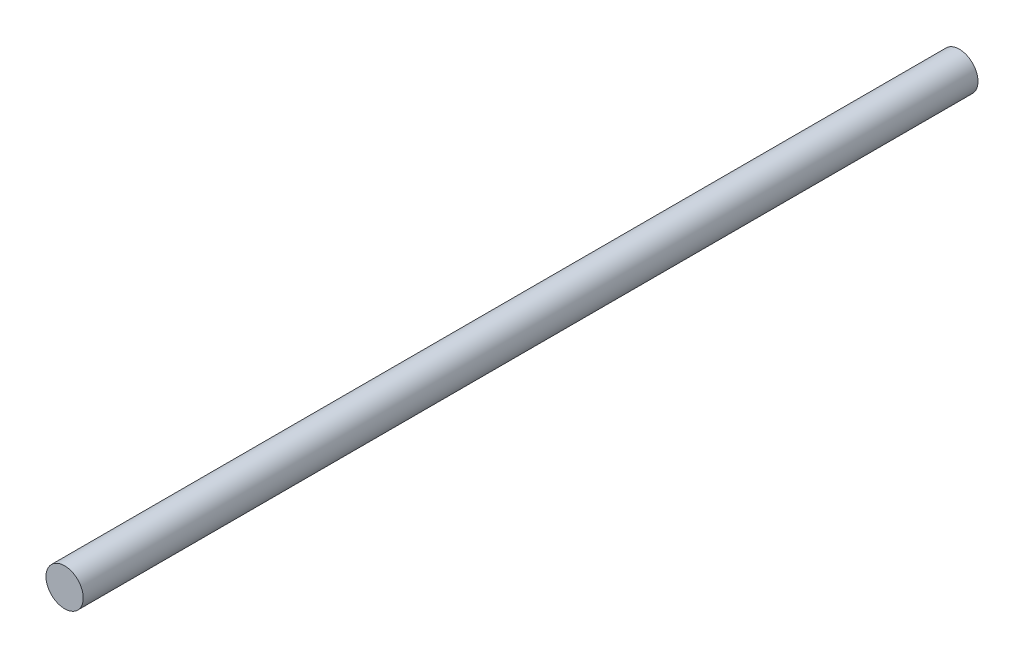
ISO-10303-21;
HEADER;
FILE_DESCRIPTION(('STEP AP214'),'2;1');
FILE_NAME('part.step','',(''),(''),'','','');
FILE_SCHEMA(('AUTOMOTIVE_DESIGN { 1 0 10303 214 1 1 1 1 }'));
ENDSEC;
DATA;
#1=APPLICATION_CONTEXT('core data for automotive mechanical design processes');
#2=APPLICATION_PROTOCOL_DEFINITION('international standard','automotive_design',2000,#1);
#3=PRODUCT_CONTEXT('',#1,'mechanical');
#4=PRODUCT('Part','Part','',(#3));
#5=PRODUCT_RELATED_PRODUCT_CATEGORY('part','',(#4));
#6=PRODUCT_DEFINITION_FORMATION('','',#4);
#7=PRODUCT_DEFINITION_CONTEXT('part definition',#1,'design');
#8=PRODUCT_DEFINITION('design','',#6,#7);
#9=PRODUCT_DEFINITION_SHAPE('','',#8);
#10=(LENGTH_UNIT() NAMED_UNIT(*) SI_UNIT(.MILLI.,.METRE.));
#11=(NAMED_UNIT(*) PLANE_ANGLE_UNIT() SI_UNIT($,.RADIAN.));
#12=(NAMED_UNIT(*) SI_UNIT($,.STERADIAN.) SOLID_ANGLE_UNIT());
#13=UNCERTAINTY_MEASURE_WITH_UNIT(LENGTH_MEASURE(1.E-05),#10,'distance_accuracy_value','');
#14=(GEOMETRIC_REPRESENTATION_CONTEXT(3) GLOBAL_UNCERTAINTY_ASSIGNED_CONTEXT((#13)) GLOBAL_UNIT_ASSIGNED_CONTEXT((#10,
#11,#12)) REPRESENTATION_CONTEXT('',''));
#15=CARTESIAN_POINT('',(0.,0.,0.));
#16=DIRECTION('',(0.,0.,1.));
#17=DIRECTION('',(1.,0.,0.));
#18=AXIS2_PLACEMENT_3D('',#15,#16,#17);
#19=CARTESIAN_POINT('',(0.,0.,-120.));
#20=DIRECTION('',(0.,0.,1.));
#21=DIRECTION('',(1.,0.,0.));
#22=AXIS2_PLACEMENT_3D('',#19,#20,#21);
#23=CYLINDRICAL_SURFACE('',#22,2.5);
#24=CARTESIAN_POINT('',(0.,0.,-120.));
#25=DIRECTION('',(0.,0.,1.));
#26=DIRECTION('',(1.,0.,0.));
#27=AXIS2_PLACEMENT_3D('',#24,#25,#26);
#28=CIRCLE('',#27,2.5);
#29=CARTESIAN_POINT('',(2.5,0.,-120.));
#30=VERTEX_POINT('',#29);
#31=EDGE_CURVE('E10',#30,#30,#28,.T.);
#32=ORIENTED_EDGE('',*,*,#31,.T.);
#33=EDGE_LOOP('',(#32));
#34=FACE_BOUND('',#33,.T.);
#35=CARTESIAN_POINT('',(0.,0.,0.));
#36=DIRECTION('',(0.,0.,1.));
#37=DIRECTION('',(1.,0.,0.));
#38=AXIS2_PLACEMENT_3D('',#35,#36,#37);
#39=CIRCLE('',#38,2.5);
#40=CARTESIAN_POINT('',(2.5,0.,0.));
#41=VERTEX_POINT('',#40);
#42=EDGE_CURVE('E40',#41,#41,#39,.T.);
#43=ORIENTED_EDGE('',*,*,#42,.F.);
#44=EDGE_LOOP('',(#43));
#45=FACE_BOUND('',#44,.T.);
#46=ADVANCED_FACE('F37',(#34,#45),#23,.T.);
#47=CARTESIAN_POINT('',(0.,0.,-120.));
#48=DIRECTION('',(0.,0.,1.));
#49=DIRECTION('',(1.,0.,0.));
#50=AXIS2_PLACEMENT_3D('',#47,#48,#49);
#51=PLANE('',#50);
#52=ORIENTED_EDGE('',*,*,#31,.F.);
#53=EDGE_LOOP('',(#52));
#54=FACE_BOUND('',#53,.T.);
#55=ADVANCED_FACE('F52',(#54),#51,.F.);
#56=CARTESIAN_POINT('',(0.,0.,0.));
#57=DIRECTION('',(0.,0.,1.));
#58=DIRECTION('',(1.,0.,0.));
#59=AXIS2_PLACEMENT_3D('',#56,#57,#58);
#60=PLANE('',#59);
#61=ORIENTED_EDGE('',*,*,#42,.T.);
#62=EDGE_LOOP('',(#61));
#63=FACE_BOUND('',#62,.T.);
#64=ADVANCED_FACE('F49',(#63),#60,.T.);
#65=CLOSED_SHELL('',(#46,#55,#64));
#66=MANIFOLD_SOLID_BREP('B2',#65);
#67=ADVANCED_BREP_SHAPE_REPRESENTATION('',(#18,#66),#14);
#68=SHAPE_DEFINITION_REPRESENTATION(#9,#67);
ENDSEC;
END-ISO-10303-21;
